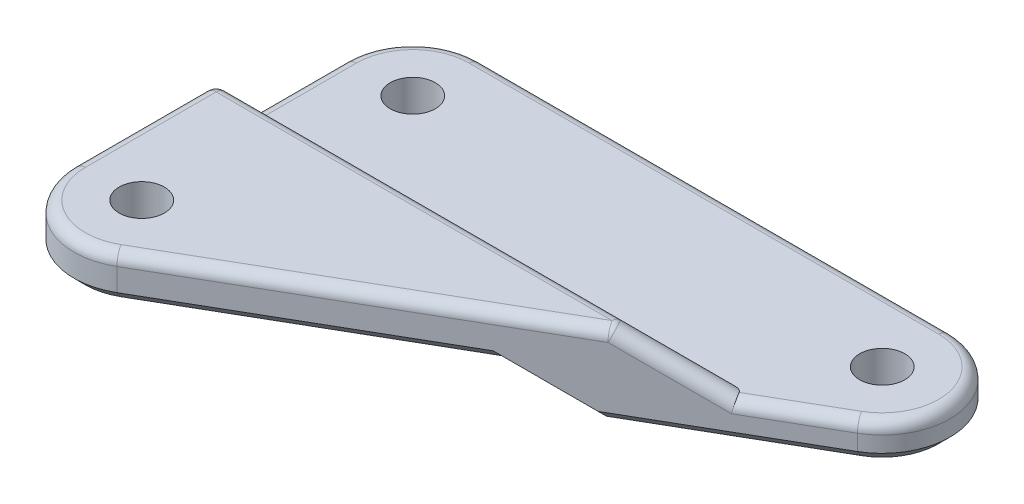
ISO-10303-21;
HEADER;
FILE_DESCRIPTION(('STEP AP214'),'2;1');
FILE_NAME('part.step','',(''),(''),'','','');
FILE_SCHEMA(('AUTOMOTIVE_DESIGN { 1 0 10303 214 1 1 1 1 }'));
ENDSEC;
DATA;
#1=APPLICATION_CONTEXT('core data for automotive mechanical design processes');
#2=APPLICATION_PROTOCOL_DEFINITION('international standard','automotive_design',2000,#1);
#3=PRODUCT_CONTEXT('',#1,'mechanical');
#4=PRODUCT('Part','Part','',(#3));
#5=PRODUCT_RELATED_PRODUCT_CATEGORY('part','',(#4));
#6=PRODUCT_DEFINITION_FORMATION('','',#4);
#7=PRODUCT_DEFINITION_CONTEXT('part definition',#1,'design');
#8=PRODUCT_DEFINITION('design','',#6,#7);
#9=PRODUCT_DEFINITION_SHAPE('','',#8);
#10=(LENGTH_UNIT() NAMED_UNIT(*) SI_UNIT(.MILLI.,.METRE.));
#11=(NAMED_UNIT(*) PLANE_ANGLE_UNIT() SI_UNIT($,.RADIAN.));
#12=(NAMED_UNIT(*) SI_UNIT($,.STERADIAN.) SOLID_ANGLE_UNIT());
#13=UNCERTAINTY_MEASURE_WITH_UNIT(LENGTH_MEASURE(1.E-05),#10,'distance_accuracy_value','');
#14=(GEOMETRIC_REPRESENTATION_CONTEXT(3) GLOBAL_UNCERTAINTY_ASSIGNED_CONTEXT((#13)) GLOBAL_UNIT_ASSIGNED_CONTEXT((#10,
#11,#12)) REPRESENTATION_CONTEXT('',''));
#15=CARTESIAN_POINT('',(0.,0.,0.));
#16=DIRECTION('',(0.,0.,1.));
#17=DIRECTION('',(1.,0.,0.));
#18=AXIS2_PLACEMENT_3D('',#15,#16,#17);
#19=CARTESIAN_POINT('',(0.,7.4,0.));
#20=DIRECTION('',(0.,-1.,0.));
#21=DIRECTION('',(0.,0.,-1.));
#22=AXIS2_PLACEMENT_3D('',#19,#20,#21);
#23=CYLINDRICAL_SURFACE('',#22,6.);
#24=DIRECTION('',(0.,-1.,0.));
#25=VECTOR('',#24,1.);
#26=CARTESIAN_POINT('',(-6.,7.4,0.));
#27=LINE('',#26,#25);
#28=CARTESIAN_POINT('',(-6.,6.4,0.));
#29=VERTEX_POINT('',#28);
#30=CARTESIAN_POINT('',(-6.,4.40000000000001,0.));
#31=VERTEX_POINT('',#30);
#32=EDGE_CURVE('E417',#29,#31,#27,.T.);
#33=ORIENTED_EDGE('',*,*,#32,.T.);
#34=CARTESIAN_POINT('',(0.,4.40000000000001,0.));
#35=DIRECTION('',(0.,-1.,0.));
#36=DIRECTION('',(0.,0.,-1.));
#37=AXIS2_PLACEMENT_3D('',#34,#35,#36);
#38=CIRCLE('',#37,6.);
#39=CARTESIAN_POINT('',(3.,4.40000000000001,5.19615242270663));
#40=VERTEX_POINT('',#39);
#41=EDGE_CURVE('E339',#31,#40,#38,.F.);
#42=ORIENTED_EDGE('',*,*,#41,.T.);
#43=DIRECTION('',(0.,-1.,0.));
#44=VECTOR('',#43,1.);
#45=CARTESIAN_POINT('',(3.,7.4,5.19615242270663));
#46=LINE('',#45,#44);
#47=CARTESIAN_POINT('',(3.,6.4,5.19615242270663));
#48=VERTEX_POINT('',#47);
#49=EDGE_CURVE('E509',#48,#40,#46,.T.);
#50=ORIENTED_EDGE('',*,*,#49,.F.);
#51=CARTESIAN_POINT('',(0.,6.4,0.));
#52=DIRECTION('',(0.,1.,0.));
#53=DIRECTION('',(0.,0.,1.));
#54=AXIS2_PLACEMENT_3D('',#51,#52,#53);
#55=CIRCLE('',#54,6.);
#56=EDGE_CURVE('E475',#48,#29,#55,.F.);
#57=ORIENTED_EDGE('',*,*,#56,.T.);
#58=EDGE_LOOP('',(#33,#42,#50,#57));
#59=FACE_BOUND('',#58,.T.);
#60=ADVANCED_FACE('F43',(#59),#23,.T.);
#61=CARTESIAN_POINT('',(0.,7.4,0.));
#62=DIRECTION('',(0.,-1.,0.));
#63=DIRECTION('',(0.,0.,-1.));
#64=AXIS2_PLACEMENT_3D('',#61,#62,#63);
#65=CYLINDRICAL_SURFACE('',#64,2.);
#66=CARTESIAN_POINT('',(0.,7.4,0.));
#67=DIRECTION('',(0.,1.,0.));
#68=DIRECTION('',(0.,0.,1.));
#69=AXIS2_PLACEMENT_3D('',#66,#67,#68);
#70=CIRCLE('',#69,2.);
#71=CARTESIAN_POINT('',(0.,7.4,2.));
#72=VERTEX_POINT('',#71);
#73=EDGE_CURVE('E575',#72,#72,#70,.T.);
#74=ORIENTED_EDGE('',*,*,#73,.T.);
#75=EDGE_LOOP('',(#74));
#76=FACE_BOUND('',#75,.T.);
#77=CARTESIAN_POINT('',(0.,3.4,0.));
#78=DIRECTION('',(0.,-1.,0.));
#79=DIRECTION('',(0.,0.,-1.));
#80=AXIS2_PLACEMENT_3D('',#77,#78,#79);
#81=CIRCLE('',#80,2.);
#82=CARTESIAN_POINT('',(0.,3.4,-2.));
#83=VERTEX_POINT('',#82);
#84=EDGE_CURVE('E227',#83,#83,#81,.T.);
#85=ORIENTED_EDGE('',*,*,#84,.T.);
#86=EDGE_LOOP('',(#85));
#87=FACE_BOUND('',#86,.T.);
#88=ADVANCED_FACE('F601',(#76,#87),#65,.F.);
#89=CARTESIAN_POINT('',(0.,7.4,-24.));
#90=DIRECTION('',(0.,-1.,0.));
#91=DIRECTION('',(0.,0.,-1.));
#92=AXIS2_PLACEMENT_3D('',#89,#90,#91);
#93=CYLINDRICAL_SURFACE('',#92,6.);
#94=DIRECTION('',(0.,-1.,0.));
#95=VECTOR('',#94,1.);
#96=CARTESIAN_POINT('',(0.,7.4,-30.));
#97=LINE('',#96,#95);
#98=CARTESIAN_POINT('',(0.,2.4,-30.));
#99=VERTEX_POINT('',#98);
#100=CARTESIAN_POINT('',(0.,1.00000000000001,-30.));
#101=VERTEX_POINT('',#100);
#102=EDGE_CURVE('E547',#99,#101,#97,.T.);
#103=ORIENTED_EDGE('',*,*,#102,.T.);
#104=CARTESIAN_POINT('',(0.,1.00000000000001,-24.));
#105=DIRECTION('',(0.,1.,0.));
#106=DIRECTION('',(0.,0.,1.));
#107=AXIS2_PLACEMENT_3D('',#104,#105,#106);
#108=CIRCLE('',#107,6.);
#109=CARTESIAN_POINT('',(-6.,1.00000000000001,-24.));
#110=VERTEX_POINT('',#109);
#111=EDGE_CURVE('E303',#101,#110,#108,.T.);
#112=ORIENTED_EDGE('',*,*,#111,.T.);
#113=DIRECTION('',(0.,-1.,0.));
#114=VECTOR('',#113,1.);
#115=CARTESIAN_POINT('',(-6.,7.4,-24.));
#116=LINE('',#115,#114);
#117=CARTESIAN_POINT('',(-6.,2.4,-24.));
#118=VERTEX_POINT('',#117);
#119=EDGE_CURVE('E388',#118,#110,#116,.T.);
#120=ORIENTED_EDGE('',*,*,#119,.F.);
#121=CARTESIAN_POINT('',(0.,2.4,-24.));
#122=DIRECTION('',(0.,1.,0.));
#123=DIRECTION('',(0.,0.,1.));
#124=AXIS2_PLACEMENT_3D('',#121,#122,#123);
#125=CIRCLE('',#124,6.);
#126=EDGE_CURVE('E444',#118,#99,#125,.F.);
#127=ORIENTED_EDGE('',*,*,#126,.T.);
#128=EDGE_LOOP('',(#103,#112,#120,#127));
#129=FACE_BOUND('',#128,.T.);
#130=ADVANCED_FACE('F546',(#129),#93,.T.);
#131=CARTESIAN_POINT('',(41.5692193816531,7.4,-24.));
#132=DIRECTION('',(0.,-1.,0.));
#133=DIRECTION('',(0.,0.,-1.));
#134=AXIS2_PLACEMENT_3D('',#131,#132,#133);
#135=CYLINDRICAL_SURFACE('',#134,6.);
#136=DIRECTION('',(0.,-1.,0.));
#137=VECTOR('',#136,1.);
#138=CARTESIAN_POINT('',(44.5692193816531,7.4,-18.8038475772934));
#139=LINE('',#138,#137);
#140=CARTESIAN_POINT('',(44.5692193816531,2.4,-18.8038475772934));
#141=VERTEX_POINT('',#140);
#142=CARTESIAN_POINT('',(44.5692193816531,1.00000000000001,-18.8038475772934));
#143=VERTEX_POINT('',#142);
#144=EDGE_CURVE('E558',#141,#143,#139,.T.);
#145=ORIENTED_EDGE('',*,*,#144,.T.);
#146=CARTESIAN_POINT('',(41.5692193816531,1.00000000000001,-24.));
#147=DIRECTION('',(0.,1.,0.));
#148=DIRECTION('',(0.,0.,1.));
#149=AXIS2_PLACEMENT_3D('',#146,#147,#148);
#150=CIRCLE('',#149,6.);
#151=CARTESIAN_POINT('',(41.5692193816531,1.00000000000001,-30.));
#152=VERTEX_POINT('',#151);
#153=EDGE_CURVE('E297',#143,#152,#150,.T.);
#154=ORIENTED_EDGE('',*,*,#153,.T.);
#155=DIRECTION('',(0.,-1.,0.));
#156=VECTOR('',#155,1.);
#157=CARTESIAN_POINT('',(41.5692193816531,7.4,-30.));
#158=LINE('',#157,#156);
#159=CARTESIAN_POINT('',(41.5692193816531,2.4,-30.));
#160=VERTEX_POINT('',#159);
#161=EDGE_CURVE('E553',#160,#152,#158,.T.);
#162=ORIENTED_EDGE('',*,*,#161,.F.);
#163=CARTESIAN_POINT('',(41.5692193816531,2.4,-24.));
#164=DIRECTION('',(0.,1.,0.));
#165=DIRECTION('',(0.,0.,1.));
#166=AXIS2_PLACEMENT_3D('',#163,#164,#165);
#167=CIRCLE('',#166,6.);
#168=EDGE_CURVE('E436',#160,#141,#167,.F.);
#169=ORIENTED_EDGE('',*,*,#168,.T.);
#170=EDGE_LOOP('',(#145,#154,#162,#169));
#171=FACE_BOUND('',#170,.T.);
#172=ADVANCED_FACE('F614',(#171),#135,.T.);
#173=CARTESIAN_POINT('',(0.,7.4,-30.));
#174=DIRECTION('',(0.,0.,1.));
#175=DIRECTION('',(1.,0.,0.));
#176=AXIS2_PLACEMENT_3D('',#173,#174,#175);
#177=PLANE('',#176);
#178=ORIENTED_EDGE('',*,*,#161,.T.);
#179=DIRECTION('',(-1.,0.,0.));
#180=VECTOR('',#179,1.);
#181=CARTESIAN_POINT('',(0.,1.00000000000001,-30.));
#182=LINE('',#181,#180);
#183=EDGE_CURVE('E300',#152,#101,#182,.T.);
#184=ORIENTED_EDGE('',*,*,#183,.T.);
#185=ORIENTED_EDGE('',*,*,#102,.F.);
#186=DIRECTION('',(-1.,0.,0.));
#187=VECTOR('',#186,1.);
#188=CARTESIAN_POINT('',(41.5692193816531,2.4,-30.));
#189=LINE('',#188,#187);
#190=EDGE_CURVE('E439',#99,#160,#189,.F.);
#191=ORIENTED_EDGE('',*,*,#190,.T.);
#192=EDGE_LOOP('',(#178,#184,#185,#191));
#193=FACE_BOUND('',#192,.T.);
#194=ADVANCED_FACE('F550',(#193),#177,.F.);
#195=CARTESIAN_POINT('',(0.,7.4,-24.));
#196=DIRECTION('',(0.,-1.,0.));
#197=DIRECTION('',(0.,0.,-1.));
#198=AXIS2_PLACEMENT_3D('',#195,#196,#197);
#199=CYLINDRICAL_SURFACE('',#198,2.);
#200=CARTESIAN_POINT('',(0.,0.,-24.));
#201=DIRECTION('',(0.,1.,0.));
#202=DIRECTION('',(0.,0.,1.));
#203=AXIS2_PLACEMENT_3D('',#200,#201,#202);
#204=CIRCLE('',#203,2.);
#205=CARTESIAN_POINT('',(0.,0.,-22.));
#206=VERTEX_POINT('',#205);
#207=EDGE_CURVE('E554',#206,#206,#204,.T.);
#208=ORIENTED_EDGE('',*,*,#207,.F.);
#209=EDGE_LOOP('',(#208));
#210=FACE_BOUND('',#209,.T.);
#211=CARTESIAN_POINT('',(0.,3.4,-24.));
#212=DIRECTION('',(0.,1.,0.));
#213=DIRECTION('',(0.,0.,1.));
#214=AXIS2_PLACEMENT_3D('',#211,#212,#213);
#215=CIRCLE('',#214,2.);
#216=CARTESIAN_POINT('',(0.,3.4,-22.));
#217=VERTEX_POINT('',#216);
#218=EDGE_CURVE('E570',#217,#217,#215,.T.);
#219=ORIENTED_EDGE('',*,*,#218,.T.);
#220=EDGE_LOOP('',(#219));
#221=FACE_BOUND('',#220,.T.);
#222=ADVANCED_FACE('F590',(#210,#221),#199,.F.);
#223=CARTESIAN_POINT('',(41.5692193816531,7.4,-24.));
#224=DIRECTION('',(0.,-1.,0.));
#225=DIRECTION('',(0.,0.,-1.));
#226=AXIS2_PLACEMENT_3D('',#223,#224,#225);
#227=CYLINDRICAL_SURFACE('',#226,2.);
#228=CARTESIAN_POINT('',(41.5692193816531,0.,-24.));
#229=DIRECTION('',(0.,1.,0.));
#230=DIRECTION('',(0.,0.,1.));
#231=AXIS2_PLACEMENT_3D('',#228,#229,#230);
#232=CIRCLE('',#231,2.);
#233=CARTESIAN_POINT('',(41.5692193816531,0.,-22.));
#234=VERTEX_POINT('',#233);
#235=EDGE_CURVE('E561',#234,#234,#232,.T.);
#236=ORIENTED_EDGE('',*,*,#235,.F.);
#237=EDGE_LOOP('',(#236));
#238=FACE_BOUND('',#237,.T.);
#239=CARTESIAN_POINT('',(41.5692193816531,3.4,-24.));
#240=DIRECTION('',(0.,1.,0.));
#241=DIRECTION('',(0.,0.,1.));
#242=AXIS2_PLACEMENT_3D('',#239,#240,#241);
#243=CIRCLE('',#242,2.);
#244=CARTESIAN_POINT('',(41.5692193816531,3.4,-22.));
#245=VERTEX_POINT('',#244);
#246=EDGE_CURVE('E226',#245,#245,#243,.T.);
#247=ORIENTED_EDGE('',*,*,#246,.T.);
#248=EDGE_LOOP('',(#247));
#249=FACE_BOUND('',#248,.T.);
#250=ADVANCED_FACE('F588',(#238,#249),#227,.F.);
#251=CARTESIAN_POINT('',(0.,7.4,-24.));
#252=DIRECTION('',(0.,1.,0.));
#253=DIRECTION('',(0.,0.,1.));
#254=AXIS2_PLACEMENT_3D('',#251,#252,#253);
#255=PLANE('',#254);
#256=DIRECTION('',(0.866025403784439,0.,-0.5));
#257=VECTOR('',#256,1.);
#258=CARTESIAN_POINT('',(32.2846096908265,7.4,-12.8660254037844));
#259=LINE('',#258,#257);
#260=CARTESIAN_POINT('',(2.5,7.4,4.33012701892219));
#261=VERTEX_POINT('',#260);
#262=CARTESIAN_POINT('',(30.0671707556122,7.4,-11.5857864376269));
#263=VERTEX_POINT('',#262);
#264=EDGE_CURVE('E468',#261,#263,#259,.T.);
#265=ORIENTED_EDGE('',*,*,#264,.T.);
#266=DIRECTION('',(-1.,0.,0.));
#267=VECTOR('',#266,1.);
#268=CARTESIAN_POINT('',(0.,7.4,-11.5857864376269));
#269=LINE('',#268,#267);
#270=CARTESIAN_POINT('',(-5.,7.4,-11.5857864376269));
#271=VERTEX_POINT('',#270);
#272=EDGE_CURVE('E235',#263,#271,#269,.T.);
#273=ORIENTED_EDGE('',*,*,#272,.T.);
#274=DIRECTION('',(0.,0.,1.));
#275=VECTOR('',#274,1.);
#276=CARTESIAN_POINT('',(-5.,7.4,0.));
#277=LINE('',#276,#275);
#278=CARTESIAN_POINT('',(-5.,7.4,0.));
#279=VERTEX_POINT('',#278);
#280=EDGE_CURVE('E447',#271,#279,#277,.T.);
#281=ORIENTED_EDGE('',*,*,#280,.T.);
#282=CARTESIAN_POINT('',(0.,7.4,0.));
#283=DIRECTION('',(0.,1.,0.));
#284=DIRECTION('',(0.,0.,1.));
#285=AXIS2_PLACEMENT_3D('',#282,#283,#284);
#286=CIRCLE('',#285,5.);
#287=EDGE_CURVE('E465',#279,#261,#286,.T.);
#288=ORIENTED_EDGE('',*,*,#287,.T.);
#289=EDGE_LOOP('',(#265,#273,#281,#288));
#290=FACE_BOUND('',#289,.T.);
#291=ORIENTED_EDGE('',*,*,#73,.F.);
#292=EDGE_LOOP('',(#291));
#293=FACE_BOUND('',#292,.T.);
#294=ADVANCED_FACE('F497',(#290,#293),#255,.T.);
#295=CARTESIAN_POINT('',(0.,0.,-24.));
#296=DIRECTION('',(0.,1.,0.));
#297=DIRECTION('',(0.,0.,1.));
#298=AXIS2_PLACEMENT_3D('',#295,#296,#297);
#299=PLANE('',#298);
#300=CARTESIAN_POINT('',(41.5692193816531,0.,-24.));
#301=DIRECTION('',(0.,1.,0.));
#302=DIRECTION('',(0.,0.,1.));
#303=AXIS2_PLACEMENT_3D('',#300,#301,#302);
#304=CIRCLE('',#303,4.99999999999998);
#305=CARTESIAN_POINT('',(41.5692193816531,0.,-29.));
#306=VERTEX_POINT('',#305);
#307=CARTESIAN_POINT('',(44.069219381653,0.,-19.6698729810778));
#308=VERTEX_POINT('',#307);
#309=EDGE_CURVE('E288',#306,#308,#304,.F.);
#310=ORIENTED_EDGE('',*,*,#309,.T.);
#311=DIRECTION('',(-0.866025403784439,0.,0.5));
#312=VECTOR('',#311,1.);
#313=CARTESIAN_POINT('',(12.8923048454132,0.,-1.66987298107783));
#314=LINE('',#313,#312);
#315=CARTESIAN_POINT('',(29.7453792062852,0.,-11.4));
#316=VERTEX_POINT('',#315);
#317=EDGE_CURVE('E291',#308,#316,#314,.T.);
#318=ORIENTED_EDGE('',*,*,#317,.T.);
#319=DIRECTION('',(-1.,0.,0.));
#320=VECTOR('',#319,1.);
#321=CARTESIAN_POINT('',(0.,0.,-11.4));
#322=LINE('',#321,#320);
#323=CARTESIAN_POINT('',(-4.99999999999998,0.,-11.4));
#324=VERTEX_POINT('',#323);
#325=EDGE_CURVE('E366',#316,#324,#322,.T.);
#326=ORIENTED_EDGE('',*,*,#325,.T.);
#327=DIRECTION('',(0.,0.,-1.));
#328=VECTOR('',#327,1.);
#329=CARTESIAN_POINT('',(-4.99999999999998,0.,-24.));
#330=LINE('',#329,#328);
#331=CARTESIAN_POINT('',(-4.99999999999998,0.,-24.));
#332=VERTEX_POINT('',#331);
#333=EDGE_CURVE('E279',#324,#332,#330,.T.);
#334=ORIENTED_EDGE('',*,*,#333,.T.);
#335=CARTESIAN_POINT('',(0.,0.,-24.));
#336=DIRECTION('',(0.,1.,0.));
#337=DIRECTION('',(0.,0.,1.));
#338=AXIS2_PLACEMENT_3D('',#335,#336,#337);
#339=CIRCLE('',#338,4.99999999999998);
#340=CARTESIAN_POINT('',(0.,0.,-29.));
#341=VERTEX_POINT('',#340);
#342=EDGE_CURVE('E282',#332,#341,#339,.F.);
#343=ORIENTED_EDGE('',*,*,#342,.T.);
#344=DIRECTION('',(1.,0.,0.));
#345=VECTOR('',#344,1.);
#346=CARTESIAN_POINT('',(0.,0.,-29.));
#347=LINE('',#346,#345);
#348=EDGE_CURVE('E285',#341,#306,#347,.T.);
#349=ORIENTED_EDGE('',*,*,#348,.T.);
#350=EDGE_LOOP('',(#310,#318,#326,#334,#343,#349));
#351=FACE_BOUND('',#350,.T.);
#352=ORIENTED_EDGE('',*,*,#207,.T.);
#353=EDGE_LOOP('',(#352));
#354=FACE_BOUND('',#353,.T.);
#355=ORIENTED_EDGE('',*,*,#235,.T.);
#356=EDGE_LOOP('',(#355));
#357=FACE_BOUND('',#356,.T.);
#358=ADVANCED_FACE('F372',(#351,#354,#357),#299,.F.);
#359=CARTESIAN_POINT('',(-6.,7.4,-24.));
#360=DIRECTION('',(1.,0.,0.));
#361=DIRECTION('',(0.,0.,-1.));
#362=AXIS2_PLACEMENT_3D('',#359,#360,#361);
#363=PLANE('',#362);
#364=DIRECTION('',(0.,0.,1.));
#365=VECTOR('',#364,1.);
#366=CARTESIAN_POINT('',(-6.,1.00000000000001,-24.));
#367=LINE('',#366,#365);
#368=CARTESIAN_POINT('',(-6.,1.00000000000001,-11.8142135623731));
#369=VERTEX_POINT('',#368);
#370=EDGE_CURVE('E306',#110,#369,#367,.T.);
#371=ORIENTED_EDGE('',*,*,#370,.T.);
#372=DIRECTION('',(0.,0.707106781186546,0.707106781186549));
#373=VECTOR('',#372,1.);
#374=CARTESIAN_POINT('',(-6.,5.10710678118656,-7.70710678118654));
#375=LINE('',#374,#373);
#376=CARTESIAN_POINT('',(-6.,4.40000000000001,-8.41421356237309));
#377=VERTEX_POINT('',#376);
#378=EDGE_CURVE('E347',#369,#377,#375,.T.);
#379=ORIENTED_EDGE('',*,*,#378,.T.);
#380=DIRECTION('',(0.,0.,1.));
#381=VECTOR('',#380,1.);
#382=CARTESIAN_POINT('',(-6.,4.40000000000001,0.));
#383=LINE('',#382,#381);
#384=EDGE_CURVE('E59',#377,#31,#383,.T.);
#385=ORIENTED_EDGE('',*,*,#384,.T.);
#386=ORIENTED_EDGE('',*,*,#32,.F.);
#387=DIRECTION('',(0.,0.,1.));
#388=VECTOR('',#387,1.);
#389=CARTESIAN_POINT('',(-6.,6.4,-12.));
#390=LINE('',#389,#388);
#391=CARTESIAN_POINT('',(-6.,6.4,-11.5857864376269));
#392=VERTEX_POINT('',#391);
#393=EDGE_CURVE('E478',#29,#392,#390,.F.);
#394=ORIENTED_EDGE('',*,*,#393,.T.);
#395=DIRECTION('',(0.,-0.707106781186547,-0.707106781186548));
#396=VECTOR('',#395,1.);
#397=CARTESIAN_POINT('',(-6.,1.69289321881345,-16.2928932188135));
#398=LINE('',#397,#396);
#399=CARTESIAN_POINT('',(-6.,2.4,-15.5857864376269));
#400=VERTEX_POINT('',#399);
#401=EDGE_CURVE('E252',#392,#400,#398,.T.);
#402=ORIENTED_EDGE('',*,*,#401,.T.);
#403=DIRECTION('',(0.,0.,1.));
#404=VECTOR('',#403,1.);
#405=CARTESIAN_POINT('',(-6.,2.4,-24.));
#406=LINE('',#405,#404);
#407=EDGE_CURVE('E197',#400,#118,#406,.F.);
#408=ORIENTED_EDGE('',*,*,#407,.T.);
#409=ORIENTED_EDGE('',*,*,#119,.T.);
#410=EDGE_LOOP('',(#371,#379,#385,#386,#394,#402,#408,#409));
#411=FACE_BOUND('',#410,.T.);
#412=ADVANCED_FACE('F383',(#411),#363,.F.);
#413=CARTESIAN_POINT('',(44.5692193816531,7.4,-18.8038475772934));
#414=DIRECTION('',(-0.5,0.,-0.866025403784439));
#415=DIRECTION('',(-0.866025403784439,0.,0.5));
#416=AXIS2_PLACEMENT_3D('',#413,#414,#415);
#417=PLANE('',#416);
#418=ORIENTED_EDGE('',*,*,#49,.T.);
#419=DIRECTION('',(0.866025403784439,0.,-0.5));
#420=VECTOR('',#419,1.);
#421=CARTESIAN_POINT('',(25.856406460551,4.40000000000001,-7.99999999999999));
#422=LINE('',#421,#420);
#423=CARTESIAN_POINT('',(24.1243556529821,4.40000000000001,-6.99999999999998));
#424=VERTEX_POINT('',#423);
#425=EDGE_CURVE('E335',#40,#424,#422,.T.);
#426=ORIENTED_EDGE('',*,*,#425,.T.);
#427=DIRECTION('',(-0.774596669241484,0.447213595499956,0.447213595499958));
#428=VECTOR('',#427,1.);
#429=CARTESIAN_POINT('',(6.74256258422037,14.4353829072479,3.03538290724798));
#430=LINE('',#429,#428);
#431=CARTESIAN_POINT('',(30.0133283987163,1.00000000000001,-10.4));
#432=VERTEX_POINT('',#431);
#433=EDGE_CURVE('E377',#424,#432,#430,.F.);
#434=ORIENTED_EDGE('',*,*,#433,.T.);
#435=DIRECTION('',(0.866025403784439,0.,-0.5));
#436=VECTOR('',#435,1.);
#437=CARTESIAN_POINT('',(44.5692193816531,1.00000000000001,-18.8038475772934));
#438=LINE('',#437,#436);
#439=EDGE_CURVE('E203',#432,#143,#438,.T.);
#440=ORIENTED_EDGE('',*,*,#439,.T.);
#441=ORIENTED_EDGE('',*,*,#144,.F.);
#442=DIRECTION('',(0.866025403784439,0.,-0.5));
#443=VECTOR('',#442,1.);
#444=CARTESIAN_POINT('',(39.712812921102,2.4,-16.));
#445=LINE('',#444,#443);
#446=CARTESIAN_POINT('',(37.4953739858877,2.4,-14.7197610338425));
#447=VERTEX_POINT('',#446);
#448=EDGE_CURVE('E433',#141,#447,#445,.F.);
#449=ORIENTED_EDGE('',*,*,#448,.T.);
#450=DIRECTION('',(-0.774596669241483,0.447213595499958,0.447213595499958));
#451=VECTOR('',#450,1.);
#452=CARTESIAN_POINT('',(33.7267625498388,4.57580882707397,-12.5439522067685));
#453=LINE('',#452,#451);
#454=CARTESIAN_POINT('',(30.5671707556122,6.4,-10.7197610338425));
#455=VERTEX_POINT('',#454);
#456=EDGE_CURVE('E249',#447,#455,#453,.T.);
#457=ORIENTED_EDGE('',*,*,#456,.T.);
#458=DIRECTION('',(0.866025403784439,0.,-0.5));
#459=VECTOR('',#458,1.);
#460=CARTESIAN_POINT('',(3.,6.4,5.19615242270663));
#461=LINE('',#460,#459);
#462=EDGE_CURVE('E472',#455,#48,#461,.F.);
#463=ORIENTED_EDGE('',*,*,#462,.T.);
#464=EDGE_LOOP('',(#418,#426,#434,#440,#441,#449,#457,#463));
#465=FACE_BOUND('',#464,.T.);
#466=ADVANCED_FACE('F409',(#465),#417,.F.);
#467=CARTESIAN_POINT('',(41.5692193816531,3.4,-24.));
#468=DIRECTION('',(0.,1.,0.));
#469=DIRECTION('',(0.,0.,1.));
#470=AXIS2_PLACEMENT_3D('',#467,#468,#469);
#471=PLANE('',#470);
#472=DIRECTION('',(1.,0.,0.));
#473=VECTOR('',#472,1.);
#474=CARTESIAN_POINT('',(-6.,3.4,-16.));
#475=LINE('',#474,#473);
#476=CARTESIAN_POINT('',(-5.,3.4,-16.));
#477=VERTEX_POINT('',#476);
#478=CARTESIAN_POINT('',(36.4880680497104,3.4,-16.));
#479=VERTEX_POINT('',#478);
#480=EDGE_CURVE('E212',#477,#479,#475,.T.);
#481=ORIENTED_EDGE('',*,*,#480,.T.);
#482=CARTESIAN_POINT('',(35.2633231783188,3.4,-14.5857864376269));
#483=DIRECTION('',(0.,1.,0.));
#484=DIRECTION('',(0.866025403784439,0.,-0.5));
#485=AXIS2_PLACEMENT_3D('',#482,#483,#484);
#486=ELLIPSE('',#485,2.23606797749979,1.);
#487=CARTESIAN_POINT('',(37.1998148514226,3.4,-15.7038204263768));
#488=VERTEX_POINT('',#487);
#489=EDGE_CURVE('E255',#479,#488,#486,.F.);
#490=ORIENTED_EDGE('',*,*,#489,.T.);
#491=DIRECTION('',(0.866025403784439,0.,-0.5));
#492=VECTOR('',#491,1.);
#493=CARTESIAN_POINT('',(44.0692193816531,3.4,-19.6698729810778));
#494=LINE('',#493,#492);
#495=CARTESIAN_POINT('',(44.0692193816531,3.4,-19.6698729810778));
#496=VERTEX_POINT('',#495);
#497=EDGE_CURVE('E429',#488,#496,#494,.T.);
#498=ORIENTED_EDGE('',*,*,#497,.T.);
#499=CARTESIAN_POINT('',(41.5692193816531,3.4,-24.));
#500=DIRECTION('',(0.,1.,0.));
#501=DIRECTION('',(0.,0.,1.));
#502=AXIS2_PLACEMENT_3D('',#499,#500,#501);
#503=CIRCLE('',#502,5.);
#504=CARTESIAN_POINT('',(41.5692193816531,3.4,-29.));
#505=VERTEX_POINT('',#504);
#506=EDGE_CURVE('E426',#496,#505,#503,.T.);
#507=ORIENTED_EDGE('',*,*,#506,.T.);
#508=DIRECTION('',(-1.,0.,0.));
#509=VECTOR('',#508,1.);
#510=CARTESIAN_POINT('',(0.,3.4,-29.));
#511=LINE('',#510,#509);
#512=CARTESIAN_POINT('',(0.,3.4,-29.));
#513=VERTEX_POINT('',#512);
#514=EDGE_CURVE('E217',#505,#513,#511,.T.);
#515=ORIENTED_EDGE('',*,*,#514,.T.);
#516=CARTESIAN_POINT('',(0.,3.4,-24.));
#517=DIRECTION('',(0.,1.,0.));
#518=DIRECTION('',(0.,0.,1.));
#519=AXIS2_PLACEMENT_3D('',#516,#517,#518);
#520=CIRCLE('',#519,5.);
#521=CARTESIAN_POINT('',(-5.,3.4,-24.));
#522=VERTEX_POINT('',#521);
#523=EDGE_CURVE('E215',#513,#522,#520,.T.);
#524=ORIENTED_EDGE('',*,*,#523,.T.);
#525=DIRECTION('',(0.,0.,1.));
#526=VECTOR('',#525,1.);
#527=CARTESIAN_POINT('',(-5.,3.4,-16.));
#528=LINE('',#527,#526);
#529=EDGE_CURVE('E195',#522,#477,#528,.T.);
#530=ORIENTED_EDGE('',*,*,#529,.T.);
#531=EDGE_LOOP('',(#481,#490,#498,#507,#515,#524,#530));
#532=FACE_BOUND('',#531,.T.);
#533=ORIENTED_EDGE('',*,*,#218,.F.);
#534=EDGE_LOOP('',(#533));
#535=FACE_BOUND('',#534,.T.);
#536=ORIENTED_EDGE('',*,*,#246,.F.);
#537=EDGE_LOOP('',(#536));
#538=FACE_BOUND('',#537,.T.);
#539=ADVANCED_FACE('F209',(#532,#535,#538),#471,.T.);
#540=CARTESIAN_POINT('',(-6.,3.4,-16.));
#541=DIRECTION('',(0.,0.707106781186548,-0.707106781186547));
#542=DIRECTION('',(-1.,0.,0.));
#543=AXIS2_PLACEMENT_3D('',#540,#541,#542);
#544=PLANE('',#543);
#545=DIRECTION('',(-1.,0.,0.));
#546=VECTOR('',#545,1.);
#547=CARTESIAN_POINT('',(-6.,7.10710678118655,-12.2928932188134));
#548=LINE('',#547,#546);
#549=CARTESIAN_POINT('',(-5.,7.10710678118655,-12.2928932188134));
#550=VERTEX_POINT('',#549);
#551=CARTESIAN_POINT('',(30.0671707556122,7.10710678118655,-12.2928932188134));
#552=VERTEX_POINT('',#551);
#553=EDGE_CURVE('E234',#550,#552,#548,.F.);
#554=ORIENTED_EDGE('',*,*,#553,.T.);
#555=DIRECTION('',(-0.774596669241484,0.447213595499958,0.447213595499958));
#556=VECTOR('',#555,1.);
#557=CARTESIAN_POINT('',(40.1549657801143,1.28291560826052,-18.1170843917395));
#558=LINE('',#557,#556);
#559=EDGE_CURVE('E224',#552,#479,#558,.F.);
#560=ORIENTED_EDGE('',*,*,#559,.T.);
#561=ORIENTED_EDGE('',*,*,#480,.F.);
#562=DIRECTION('',(0.,-0.707106781186547,-0.707106781186548));
#563=VECTOR('',#562,1.);
#564=CARTESIAN_POINT('',(-5.,6.4,-13.));
#565=LINE('',#564,#563);
#566=EDGE_CURVE('E221',#477,#550,#565,.F.);
#567=ORIENTED_EDGE('',*,*,#566,.T.);
#568=EDGE_LOOP('',(#554,#560,#561,#567));
#569=FACE_BOUND('',#568,.T.);
#570=ADVANCED_FACE('F220',(#569),#544,.T.);
#571=CARTESIAN_POINT('',(0.,3.4,0.));
#572=DIRECTION('',(0.,-1.,0.));
#573=DIRECTION('',(0.,0.,-1.));
#574=AXIS2_PLACEMENT_3D('',#571,#572,#573);
#575=PLANE('',#574);
#576=ORIENTED_EDGE('',*,*,#84,.F.);
#577=EDGE_LOOP('',(#576));
#578=FACE_BOUND('',#577,.T.);
#579=DIRECTION('',(1.,0.,0.));
#580=VECTOR('',#579,1.);
#581=CARTESIAN_POINT('',(-6.,3.4,-8.));
#582=LINE('',#581,#580);
#583=CARTESIAN_POINT('',(-5.,3.4,-8.));
#584=VERTEX_POINT('',#583);
#585=CARTESIAN_POINT('',(23.856406460551,3.4,-8.));
#586=VERTEX_POINT('',#585);
#587=EDGE_CURVE('E369',#584,#586,#582,.T.);
#588=ORIENTED_EDGE('',*,*,#587,.T.);
#589=DIRECTION('',(-0.866025403784439,0.,0.5));
#590=VECTOR('',#589,1.);
#591=CARTESIAN_POINT('',(2.5,3.4,4.33012701892219));
#592=LINE('',#591,#590);
#593=CARTESIAN_POINT('',(2.5,3.4,4.33012701892219));
#594=VERTEX_POINT('',#593);
#595=EDGE_CURVE('E331',#586,#594,#592,.T.);
#596=ORIENTED_EDGE('',*,*,#595,.T.);
#597=CARTESIAN_POINT('',(0.,3.4,0.));
#598=DIRECTION('',(0.,-1.,0.));
#599=DIRECTION('',(0.,0.,-1.));
#600=AXIS2_PLACEMENT_3D('',#597,#598,#599);
#601=CIRCLE('',#600,5.);
#602=CARTESIAN_POINT('',(-5.,3.4,0.));
#603=VERTEX_POINT('',#602);
#604=EDGE_CURVE('E328',#594,#603,#601,.T.);
#605=ORIENTED_EDGE('',*,*,#604,.T.);
#606=DIRECTION('',(0.,0.,-1.));
#607=VECTOR('',#606,1.);
#608=CARTESIAN_POINT('',(-5.,3.4,-8.));
#609=LINE('',#608,#607);
#610=EDGE_CURVE('E309',#603,#584,#609,.T.);
#611=ORIENTED_EDGE('',*,*,#610,.T.);
#612=EDGE_LOOP('',(#588,#596,#605,#611));
#613=FACE_BOUND('',#612,.T.);
#614=ADVANCED_FACE('F621',(#578,#613),#575,.T.);
#615=CARTESIAN_POINT('',(-6.,3.4,-8.));
#616=DIRECTION('',(0.,0.707106781186549,-0.707106781186546));
#617=DIRECTION('',(1.,0.,0.));
#618=AXIS2_PLACEMENT_3D('',#615,#616,#617);
#619=PLANE('',#618);
#620=ORIENTED_EDGE('',*,*,#587,.F.);
#621=DIRECTION('',(0.,0.707106781186546,0.707106781186549));
#622=VECTOR('',#621,1.);
#623=CARTESIAN_POINT('',(-4.99999999999999,1.00000000000001,-10.4));
#624=LINE('',#623,#622);
#625=EDGE_CURVE('E357',#584,#324,#624,.F.);
#626=ORIENTED_EDGE('',*,*,#625,.T.);
#627=ORIENTED_EDGE('',*,*,#325,.F.);
#628=DIRECTION('',(0.186156787897401,0.694746590606862,0.694746590606865));
#629=VECTOR('',#628,1.);
#630=CARTESIAN_POINT('',(29.3861025330447,-1.34083879850752,-12.7408387985075));
#631=LINE('',#630,#629);
#632=EDGE_CURVE('E294',#316,#432,#631,.T.);
#633=ORIENTED_EDGE('',*,*,#632,.T.);
#634=ORIENTED_EDGE('',*,*,#433,.F.);
#635=DIRECTION('',(0.18615678789737,0.694746590606866,0.694746590606869));
#636=VECTOR('',#635,1.);
#637=CARTESIAN_POINT('',(24.7109915271828,6.58935488805979,-4.8106451119402));
#638=LINE('',#637,#636);
#639=EDGE_CURVE('E344',#424,#586,#638,.F.);
#640=ORIENTED_EDGE('',*,*,#639,.T.);
#641=EDGE_LOOP('',(#620,#626,#627,#633,#634,#640));
#642=FACE_BOUND('',#641,.T.);
#643=ADVANCED_FACE('F365',(#642),#619,.F.);
#644=CARTESIAN_POINT('',(-5.,2.4,-24.));
#645=DIRECTION('',(0.,0.,-1.));
#646=DIRECTION('',(-1.,0.,0.));
#647=AXIS2_PLACEMENT_3D('',#644,#645,#646);
#648=CYLINDRICAL_SURFACE('',#647,1.);
#649=ORIENTED_EDGE('',*,*,#407,.F.);
#650=CARTESIAN_POINT('',(-5.,2.4,-15.5857864376269));
#651=DIRECTION('',(0.,0.38268343236509,0.923879532511287));
#652=DIRECTION('',(0.,0.923879532511287,-0.382683432365089));
#653=AXIS2_PLACEMENT_3D('',#650,#651,#652);
#654=ELLIPSE('',#653,1.08239220029239,1.);
#655=EDGE_CURVE('E191',#400,#477,#654,.F.);
#656=ORIENTED_EDGE('',*,*,#655,.T.);
#657=ORIENTED_EDGE('',*,*,#529,.F.);
#658=CARTESIAN_POINT('',(-5.,2.4,-24.));
#659=DIRECTION('',(0.,0.,-1.));
#660=DIRECTION('',(-1.,0.,0.));
#661=AXIS2_PLACEMENT_3D('',#658,#659,#660);
#662=CIRCLE('',#661,1.);
#663=EDGE_CURVE('E460',#118,#522,#662,.T.);
#664=ORIENTED_EDGE('',*,*,#663,.F.);
#665=EDGE_LOOP('',(#649,#656,#657,#664));
#666=FACE_BOUND('',#665,.T.);
#667=ADVANCED_FACE('F193',(#666),#648,.T.);
#668=CARTESIAN_POINT('',(0.,2.4,-24.));
#669=DIRECTION('',(0.,1.,0.));
#670=DIRECTION('',(0.,0.,1.));
#671=AXIS2_PLACEMENT_3D('',#668,#669,#670);
#672=TOROIDAL_SURFACE('',#671,5.,1.);
#673=ORIENTED_EDGE('',*,*,#663,.T.);
#674=ORIENTED_EDGE('',*,*,#523,.F.);
#675=CARTESIAN_POINT('',(0.,2.4,-29.));
#676=DIRECTION('',(1.,0.,0.));
#677=DIRECTION('',(0.,1.,0.));
#678=AXIS2_PLACEMENT_3D('',#675,#676,#677);
#679=CIRCLE('',#678,1.);
#680=EDGE_CURVE('E456',#99,#513,#679,.T.);
#681=ORIENTED_EDGE('',*,*,#680,.F.);
#682=ORIENTED_EDGE('',*,*,#126,.F.);
#683=EDGE_LOOP('',(#673,#674,#681,#682));
#684=FACE_BOUND('',#683,.T.);
#685=ADVANCED_FACE('F541',(#684),#672,.T.);
#686=CARTESIAN_POINT('',(41.5692193816531,2.4,-29.));
#687=DIRECTION('',(1.,0.,0.));
#688=DIRECTION('',(0.,0.,-1.));
#689=AXIS2_PLACEMENT_3D('',#686,#687,#688);
#690=CYLINDRICAL_SURFACE('',#689,1.);
#691=ORIENTED_EDGE('',*,*,#680,.T.);
#692=ORIENTED_EDGE('',*,*,#514,.F.);
#693=CARTESIAN_POINT('',(41.5692193816531,2.4,-29.));
#694=DIRECTION('',(1.,0.,0.));
#695=DIRECTION('',(0.,0.,-1.));
#696=AXIS2_PLACEMENT_3D('',#693,#694,#695);
#697=CIRCLE('',#696,1.);
#698=EDGE_CURVE('E451',#160,#505,#697,.T.);
#699=ORIENTED_EDGE('',*,*,#698,.F.);
#700=ORIENTED_EDGE('',*,*,#190,.F.);
#701=EDGE_LOOP('',(#691,#692,#699,#700));
#702=FACE_BOUND('',#701,.T.);
#703=ADVANCED_FACE('F538',(#702),#690,.T.);
#704=CARTESIAN_POINT('',(41.5692193816531,2.4,-24.));
#705=DIRECTION('',(0.,1.,0.));
#706=DIRECTION('',(0.,0.,1.));
#707=AXIS2_PLACEMENT_3D('',#704,#705,#706);
#708=TOROIDAL_SURFACE('',#707,5.,1.);
#709=ORIENTED_EDGE('',*,*,#698,.T.);
#710=ORIENTED_EDGE('',*,*,#506,.F.);
#711=CARTESIAN_POINT('',(44.0692193816531,2.4,-19.6698729810778));
#712=DIRECTION('',(-0.866025403784439,0.,0.5));
#713=DIRECTION('',(0.5,0.,0.866025403784439));
#714=AXIS2_PLACEMENT_3D('',#711,#712,#713);
#715=CIRCLE('',#714,1.);
#716=EDGE_CURVE('E448',#141,#496,#715,.T.);
#717=ORIENTED_EDGE('',*,*,#716,.F.);
#718=ORIENTED_EDGE('',*,*,#168,.F.);
#719=EDGE_LOOP('',(#709,#710,#717,#718));
#720=FACE_BOUND('',#719,.T.);
#721=ADVANCED_FACE('F534',(#720),#708,.T.);
#722=CARTESIAN_POINT('',(44.0692193816531,2.4,-19.6698729810778));
#723=DIRECTION('',(-0.866025403784439,0.,0.5));
#724=DIRECTION('',(0.5,0.,0.866025403784439));
#725=AXIS2_PLACEMENT_3D('',#722,#723,#724);
#726=CYLINDRICAL_SURFACE('',#725,1.);
#727=ORIENTED_EDGE('',*,*,#497,.F.);
#728=CARTESIAN_POINT('',(36.9953739858877,2.4,-15.5857864376269));
#729=DIRECTION('',(0.842858349086588,-0.229752920547361,-0.486624494733865));
#730=DIRECTION('',(-0.198971865787682,-0.97324898946773,0.11487646027368));
#731=AXIS2_PLACEMENT_3D('',#728,#729,#730);
#732=ELLIPSE('',#731,1.02748629674602,1.);
#733=EDGE_CURVE('E204',#488,#447,#732,.T.);
#734=ORIENTED_EDGE('',*,*,#733,.T.);
#735=ORIENTED_EDGE('',*,*,#448,.F.);
#736=ORIENTED_EDGE('',*,*,#716,.T.);
#737=EDGE_LOOP('',(#727,#734,#735,#736));
#738=FACE_BOUND('',#737,.T.);
#739=ADVANCED_FACE('F529',(#738),#726,.T.);
#740=CARTESIAN_POINT('',(-5.,6.4,-24.));
#741=DIRECTION('',(0.,0.,-1.));
#742=DIRECTION('',(-1.,0.,0.));
#743=AXIS2_PLACEMENT_3D('',#740,#741,#742);
#744=CYLINDRICAL_SURFACE('',#743,1.);
#745=ORIENTED_EDGE('',*,*,#280,.F.);
#746=CARTESIAN_POINT('',(-5.,6.4,-11.5857864376269));
#747=DIRECTION('',(0.,0.,-1.));
#748=DIRECTION('',(-1.,0.,0.));
#749=AXIS2_PLACEMENT_3D('',#746,#747,#748);
#750=CIRCLE('',#749,1.);
#751=EDGE_CURVE('E246',#271,#392,#750,.F.);
#752=ORIENTED_EDGE('',*,*,#751,.T.);
#753=ORIENTED_EDGE('',*,*,#393,.F.);
#754=CARTESIAN_POINT('',(-5.,6.4,0.));
#755=DIRECTION('',(0.,0.,1.));
#756=DIRECTION('',(1.,0.,0.));
#757=AXIS2_PLACEMENT_3D('',#754,#755,#756);
#758=CIRCLE('',#757,1.);
#759=EDGE_CURVE('E452',#279,#29,#758,.T.);
#760=ORIENTED_EDGE('',*,*,#759,.F.);
#761=EDGE_LOOP('',(#745,#752,#753,#760));
#762=FACE_BOUND('',#761,.T.);
#763=ADVANCED_FACE('F514',(#762),#744,.T.);
#764=CARTESIAN_POINT('',(0.,6.4,0.));
#765=DIRECTION('',(0.,1.,0.));
#766=DIRECTION('',(0.,0.,1.));
#767=AXIS2_PLACEMENT_3D('',#764,#765,#766);
#768=TOROIDAL_SURFACE('',#767,5.,1.);
#769=ORIENTED_EDGE('',*,*,#759,.T.);
#770=ORIENTED_EDGE('',*,*,#56,.F.);
#771=CARTESIAN_POINT('',(2.5,6.4,4.33012701892219));
#772=DIRECTION('',(0.866025403784438,0.,-0.5));
#773=DIRECTION('',(-0.5,0.,-0.866025403784439));
#774=AXIS2_PLACEMENT_3D('',#771,#772,#773);
#775=CIRCLE('',#774,1.);
#776=EDGE_CURVE('E275',#261,#48,#775,.T.);
#777=ORIENTED_EDGE('',*,*,#776,.F.);
#778=ORIENTED_EDGE('',*,*,#287,.F.);
#779=EDGE_LOOP('',(#769,#770,#777,#778));
#780=FACE_BOUND('',#779,.T.);
#781=ADVANCED_FACE('F506',(#780),#768,.T.);
#782=CARTESIAN_POINT('',(12.8923048454133,6.4,-1.66987298107781));
#783=DIRECTION('',(-0.866025403784439,0.,0.5));
#784=DIRECTION('',(0.5,0.,0.866025403784439));
#785=AXIS2_PLACEMENT_3D('',#782,#783,#784);
#786=CYLINDRICAL_SURFACE('',#785,1.);
#787=ORIENTED_EDGE('',*,*,#462,.F.);
#788=CARTESIAN_POINT('',(30.0671707556122,6.4,-11.5857864376269));
#789=DIRECTION('',(-0.866025403784439,0.,0.5));
#790=DIRECTION('',(0.5,0.,0.866025403784439));
#791=AXIS2_PLACEMENT_3D('',#788,#789,#790);
#792=CIRCLE('',#791,1.);
#793=EDGE_CURVE('E240',#455,#263,#792,.T.);
#794=ORIENTED_EDGE('',*,*,#793,.T.);
#795=ORIENTED_EDGE('',*,*,#264,.F.);
#796=ORIENTED_EDGE('',*,*,#776,.T.);
#797=EDGE_LOOP('',(#787,#794,#795,#796));
#798=FACE_BOUND('',#797,.T.);
#799=ADVANCED_FACE('F493',(#798),#786,.T.);
#800=CARTESIAN_POINT('',(-5.,0.692893218813449,-17.2928932188135));
#801=DIRECTION('',(0.,0.707106781186547,0.707106781186548));
#802=DIRECTION('',(0.,-0.707106781186548,0.707106781186547));
#803=AXIS2_PLACEMENT_3D('',#800,#801,#802);
#804=CYLINDRICAL_SURFACE('',#803,1.);
#805=ORIENTED_EDGE('',*,*,#655,.F.);
#806=ORIENTED_EDGE('',*,*,#401,.F.);
#807=CARTESIAN_POINT('',(-5.,6.4,-11.5857864376269));
#808=DIRECTION('',(0.,0.707106781186547,0.707106781186548));
#809=DIRECTION('',(0.,-0.707106781186548,0.707106781186547));
#810=AXIS2_PLACEMENT_3D('',#807,#808,#809);
#811=CIRCLE('',#810,1.);
#812=EDGE_CURVE('E231',#550,#392,#811,.T.);
#813=ORIENTED_EDGE('',*,*,#812,.F.);
#814=ORIENTED_EDGE('',*,*,#566,.F.);
#815=EDGE_LOOP('',(#805,#806,#813,#814));
#816=FACE_BOUND('',#815,.T.);
#817=ADVANCED_FACE('F229',(#816),#804,.T.);
#818=CARTESIAN_POINT('',(-5.,6.4,-11.5857864376269));
#819=DIRECTION('',(0.,0.707106781186548,-0.707106781186547));
#820=DIRECTION('',(0.,0.707106781186547,0.707106781186548));
#821=AXIS2_PLACEMENT_3D('',#818,#819,#820);
#822=SPHERICAL_SURFACE('',#821,1.);
#823=ORIENTED_EDGE('',*,*,#812,.T.);
#824=ORIENTED_EDGE('',*,*,#751,.F.);
#825=CARTESIAN_POINT('',(-5.,6.4,-11.5857864376269));
#826=DIRECTION('',(1.,0.,0.));
#827=DIRECTION('',(0.,0.,-1.));
#828=AXIS2_PLACEMENT_3D('',#825,#826,#827);
#829=CIRCLE('',#828,1.);
#830=EDGE_CURVE('E269',#550,#271,#829,.T.);
#831=ORIENTED_EDGE('',*,*,#830,.F.);
#832=EDGE_LOOP('',(#823,#824,#831));
#833=FACE_BOUND('',#832,.T.);
#834=ADVANCED_FACE('F517',(#833),#822,.T.);
#835=CARTESIAN_POINT('',(0.,6.4,-11.5857864376269));
#836=DIRECTION('',(-1.,0.,0.));
#837=DIRECTION('',(0.,0.,1.));
#838=AXIS2_PLACEMENT_3D('',#835,#836,#837);
#839=CYLINDRICAL_SURFACE('',#838,1.);
#840=ORIENTED_EDGE('',*,*,#830,.T.);
#841=ORIENTED_EDGE('',*,*,#272,.F.);
#842=CARTESIAN_POINT('',(30.0671707556122,6.4,-11.5857864376269));
#843=DIRECTION('',(1.,0.,0.));
#844=DIRECTION('',(0.,0.,-1.));
#845=AXIS2_PLACEMENT_3D('',#842,#843,#844);
#846=CIRCLE('',#845,1.);
#847=EDGE_CURVE('E265',#552,#263,#846,.T.);
#848=ORIENTED_EDGE('',*,*,#847,.F.);
#849=ORIENTED_EDGE('',*,*,#553,.F.);
#850=EDGE_LOOP('',(#840,#841,#848,#849));
#851=FACE_BOUND('',#850,.T.);
#852=ADVANCED_FACE('F520',(#851),#839,.T.);
#853=CARTESIAN_POINT('',(40.9223994949311,0.132730765239274,-17.8530556723876));
#854=DIRECTION('',(0.774596669241484,-0.447213595499958,-0.447213595499958));
#855=DIRECTION('',(-0.5,0.,-0.866025403784439));
#856=AXIS2_PLACEMENT_3D('',#853,#854,#855);
#857=CYLINDRICAL_SURFACE('',#856,1.);
#858=ORIENTED_EDGE('',*,*,#489,.F.);
#859=ORIENTED_EDGE('',*,*,#559,.F.);
#860=CARTESIAN_POINT('',(30.0671707556122,6.4,-11.5857864376269));
#861=DIRECTION('',(-0.774596669241484,0.447213595499957,0.447213595499958));
#862=DIRECTION('',(0.5,0.,0.866025403784439));
#863=AXIS2_PLACEMENT_3D('',#860,#861,#862);
#864=CIRCLE('',#863,1.);
#865=EDGE_CURVE('E261',#455,#552,#864,.T.);
#866=ORIENTED_EDGE('',*,*,#865,.F.);
#867=ORIENTED_EDGE('',*,*,#456,.F.);
#868=ORIENTED_EDGE('',*,*,#733,.F.);
#869=EDGE_LOOP('',(#858,#859,#866,#867,#868));
#870=FACE_BOUND('',#869,.T.);
#871=ADVANCED_FACE('F523',(#870),#857,.T.);
#872=CARTESIAN_POINT('',(30.0671707556122,6.4,-11.5857864376269));
#873=DIRECTION('',(0.,0.707106781186548,-0.707106781186547));
#874=DIRECTION('',(0.,0.707106781186547,0.707106781186548));
#875=AXIS2_PLACEMENT_3D('',#872,#873,#874);
#876=SPHERICAL_SURFACE('',#875,1.);
#877=ORIENTED_EDGE('',*,*,#847,.T.);
#878=ORIENTED_EDGE('',*,*,#793,.F.);
#879=ORIENTED_EDGE('',*,*,#865,.T.);
#880=EDGE_LOOP('',(#877,#878,#879));
#881=FACE_BOUND('',#880,.T.);
#882=ADVANCED_FACE('F643',(#881),#876,.T.);
#883=CARTESIAN_POINT('',(-6.,1.00000000000001,-24.));
#884=DIRECTION('',(0.707106781186545,0.70710678118655,0.));
#885=DIRECTION('',(0.,0.,1.));
#886=AXIS2_PLACEMENT_3D('',#883,#884,#885);
#887=PLANE('',#886);
#888=ORIENTED_EDGE('',*,*,#333,.F.);
#889=DIRECTION('',(-0.678598344545849,0.678598344545844,-0.281084637714822));
#890=VECTOR('',#889,1.);
#891=CARTESIAN_POINT('',(-8.32436040630563,3.32436040630563,-12.7769951665079));
#892=LINE('',#891,#890);
#893=EDGE_CURVE('E53',#324,#369,#892,.T.);
#894=ORIENTED_EDGE('',*,*,#893,.T.);
#895=ORIENTED_EDGE('',*,*,#370,.F.);
#896=DIRECTION('',(-0.70710678118655,0.707106781186545,0.));
#897=VECTOR('',#896,1.);
#898=CARTESIAN_POINT('',(-4.99999999999998,0.,-24.));
#899=LINE('',#898,#897);
#900=EDGE_CURVE('E266',#332,#110,#899,.T.);
#901=ORIENTED_EDGE('',*,*,#900,.F.);
#902=EDGE_LOOP('',(#888,#894,#895,#901));
#903=FACE_BOUND('',#902,.T.);
#904=ADVANCED_FACE('F379',(#903),#887,.F.);
#905=CARTESIAN_POINT('',(0.,1.00000000000001,-24.));
#906=DIRECTION('',(0.,1.,0.));
#907=DIRECTION('',(0.,0.,1.));
#908=AXIS2_PLACEMENT_3D('',#905,#906,#907);
#909=CONICAL_SURFACE('',#908,6.,0.785398163397452);
#910=ORIENTED_EDGE('',*,*,#900,.T.);
#911=ORIENTED_EDGE('',*,*,#111,.F.);
#912=DIRECTION('',(0.,0.707106781186545,-0.70710678118655));
#913=VECTOR('',#912,1.);
#914=CARTESIAN_POINT('',(0.,0.,-29.));
#915=LINE('',#914,#913);
#916=EDGE_CURVE('E318',#341,#101,#915,.T.);
#917=ORIENTED_EDGE('',*,*,#916,.F.);
#918=ORIENTED_EDGE('',*,*,#342,.F.);
#919=EDGE_LOOP('',(#910,#911,#917,#918));
#920=FACE_BOUND('',#919,.T.);
#921=ADVANCED_FACE('F391',(#920),#909,.T.);
#922=CARTESIAN_POINT('',(0.,1.00000000000001,-30.));
#923=DIRECTION('',(0.,0.70710678118655,0.707106781186545));
#924=DIRECTION('',(-1.,0.,0.));
#925=AXIS2_PLACEMENT_3D('',#922,#923,#924);
#926=PLANE('',#925);
#927=ORIENTED_EDGE('',*,*,#916,.T.);
#928=ORIENTED_EDGE('',*,*,#183,.F.);
#929=DIRECTION('',(0.,0.707106781186545,-0.70710678118655));
#930=VECTOR('',#929,1.);
#931=CARTESIAN_POINT('',(41.5692193816531,0.,-29.));
#932=LINE('',#931,#930);
#933=EDGE_CURVE('E313',#306,#152,#932,.T.);
#934=ORIENTED_EDGE('',*,*,#933,.F.);
#935=ORIENTED_EDGE('',*,*,#348,.F.);
#936=EDGE_LOOP('',(#927,#928,#934,#935));
#937=FACE_BOUND('',#936,.T.);
#938=ADVANCED_FACE('F398',(#937),#926,.F.);
#939=CARTESIAN_POINT('',(41.5692193816531,1.00000000000001,-24.));
#940=DIRECTION('',(0.,1.,0.));
#941=DIRECTION('',(0.,0.,1.));
#942=AXIS2_PLACEMENT_3D('',#939,#940,#941);
#943=CONICAL_SURFACE('',#942,6.,0.785398163397452);
#944=ORIENTED_EDGE('',*,*,#933,.T.);
#945=ORIENTED_EDGE('',*,*,#153,.F.);
#946=DIRECTION('',(0.353553390593277,0.707106781186544,0.612372435695797));
#947=VECTOR('',#946,1.);
#948=CARTESIAN_POINT('',(44.069219381653,0.,-19.6698729810778));
#949=LINE('',#948,#947);
#950=EDGE_CURVE('E310',#308,#143,#949,.T.);
#951=ORIENTED_EDGE('',*,*,#950,.F.);
#952=ORIENTED_EDGE('',*,*,#309,.F.);
#953=EDGE_LOOP('',(#944,#945,#951,#952));
#954=FACE_BOUND('',#953,.T.);
#955=ADVANCED_FACE('F402',(#954),#943,.T.);
#956=CARTESIAN_POINT('',(44.5692193816531,1.00000000000001,-18.8038475772934));
#957=DIRECTION('',(-0.353553390593271,0.707106781186553,-0.61237243569579));
#958=DIRECTION('',(0.866025403784439,0.,-0.5));
#959=AXIS2_PLACEMENT_3D('',#956,#957,#958);
#960=PLANE('',#959);
#961=ORIENTED_EDGE('',*,*,#632,.F.);
#962=ORIENTED_EDGE('',*,*,#317,.F.);
#963=ORIENTED_EDGE('',*,*,#950,.T.);
#964=ORIENTED_EDGE('',*,*,#439,.F.);
#965=EDGE_LOOP('',(#961,#962,#963,#964));
#966=FACE_BOUND('',#965,.T.);
#967=ADVANCED_FACE('F405',(#966),#960,.F.);
#968=CARTESIAN_POINT('',(-5.,3.4,0.));
#969=DIRECTION('',(-0.70710678118655,-0.707106781186545,0.));
#970=DIRECTION('',(0.,0.,1.));
#971=AXIS2_PLACEMENT_3D('',#968,#969,#970);
#972=PLANE('',#971);
#973=ORIENTED_EDGE('',*,*,#384,.F.);
#974=DIRECTION('',(-0.678598344545846,0.678598344545851,-0.281084637714811));
#975=VECTOR('',#974,1.);
#976=CARTESIAN_POINT('',(-4.30247856610177,2.70247856610176,-7.71107716203344));
#977=LINE('',#976,#975);
#978=EDGE_CURVE('E11',#377,#584,#977,.F.);
#979=ORIENTED_EDGE('',*,*,#978,.T.);
#980=ORIENTED_EDGE('',*,*,#610,.F.);
#981=DIRECTION('',(0.707106781186545,-0.70710678118655,0.));
#982=VECTOR('',#981,1.);
#983=CARTESIAN_POINT('',(-6.,4.40000000000001,0.));
#984=LINE('',#983,#982);
#985=EDGE_CURVE('E314',#31,#603,#984,.T.);
#986=ORIENTED_EDGE('',*,*,#985,.F.);
#987=EDGE_LOOP('',(#973,#979,#980,#986));
#988=FACE_BOUND('',#987,.T.);
#989=ADVANCED_FACE('F661',(#988),#972,.T.);
#990=CARTESIAN_POINT('',(0.,3.4,0.));
#991=DIRECTION('',(0.,1.,0.));
#992=DIRECTION('',(0.,0.,1.));
#993=AXIS2_PLACEMENT_3D('',#990,#991,#992);
#994=CONICAL_SURFACE('',#993,5.,0.785398163397445);
#995=ORIENTED_EDGE('',*,*,#985,.T.);
#996=ORIENTED_EDGE('',*,*,#604,.F.);
#997=DIRECTION('',(-0.353553390593272,-0.70710678118655,-0.612372435695792));
#998=VECTOR('',#997,1.);
#999=CARTESIAN_POINT('',(3.,4.40000000000001,5.19615242270663));
#1000=LINE('',#999,#998);
#1001=EDGE_CURVE('E348',#40,#594,#1000,.T.);
#1002=ORIENTED_EDGE('',*,*,#1001,.F.);
#1003=ORIENTED_EDGE('',*,*,#41,.F.);
#1004=EDGE_LOOP('',(#995,#996,#1002,#1003));
#1005=FACE_BOUND('',#1004,.T.);
#1006=ADVANCED_FACE('F687',(#1005),#994,.T.);
#1007=CARTESIAN_POINT('',(2.5,3.4,4.33012701892219));
#1008=DIRECTION('',(0.353553390593275,-0.707106781186545,0.612372435695797));
#1009=DIRECTION('',(0.866025403784439,0.,-0.5));
#1010=AXIS2_PLACEMENT_3D('',#1007,#1008,#1009);
#1011=PLANE('',#1010);
#1012=ORIENTED_EDGE('',*,*,#639,.F.);
#1013=ORIENTED_EDGE('',*,*,#425,.F.);
#1014=ORIENTED_EDGE('',*,*,#1001,.T.);
#1015=ORIENTED_EDGE('',*,*,#595,.F.);
#1016=EDGE_LOOP('',(#1012,#1013,#1014,#1015));
#1017=FACE_BOUND('',#1016,.T.);
#1018=ADVANCED_FACE('F681',(#1017),#1011,.T.);
#1019=CARTESIAN_POINT('',(-6.,-1.89289321881346,-14.7071067811866));
#1020=DIRECTION('',(0.707106781186546,0.500000000000002,-0.5));
#1021=DIRECTION('',(0.,0.707106781186546,0.707106781186549));
#1022=AXIS2_PLACEMENT_3D('',#1019,#1020,#1021);
#1023=PLANE('',#1022);
#1024=ORIENTED_EDGE('',*,*,#893,.F.);
#1025=ORIENTED_EDGE('',*,*,#625,.F.);
#1026=ORIENTED_EDGE('',*,*,#978,.F.);
#1027=ORIENTED_EDGE('',*,*,#378,.F.);
#1028=EDGE_LOOP('',(#1024,#1025,#1026,#1027));
#1029=FACE_BOUND('',#1028,.T.);
#1030=ADVANCED_FACE('F46',(#1029),#1023,.F.);
#1031=CLOSED_SHELL('',(#60,#88,#130,#172,#194,#222,#250,#294,#358,#412,#466,#539,#570,#614,#643,
#667,#685,#703,#721,#739,#763,#781,#799,#817,#834,#852,#871,#882,#904,#921,#938,#955,#967,#989,
#1006,#1018,#1030));
#1032=MANIFOLD_SOLID_BREP('B2',#1031);
#1033=ADVANCED_BREP_SHAPE_REPRESENTATION('',(#18,#1032),#14);
#1034=SHAPE_DEFINITION_REPRESENTATION(#9,#1033);
ENDSEC;
END-ISO-10303-21;
